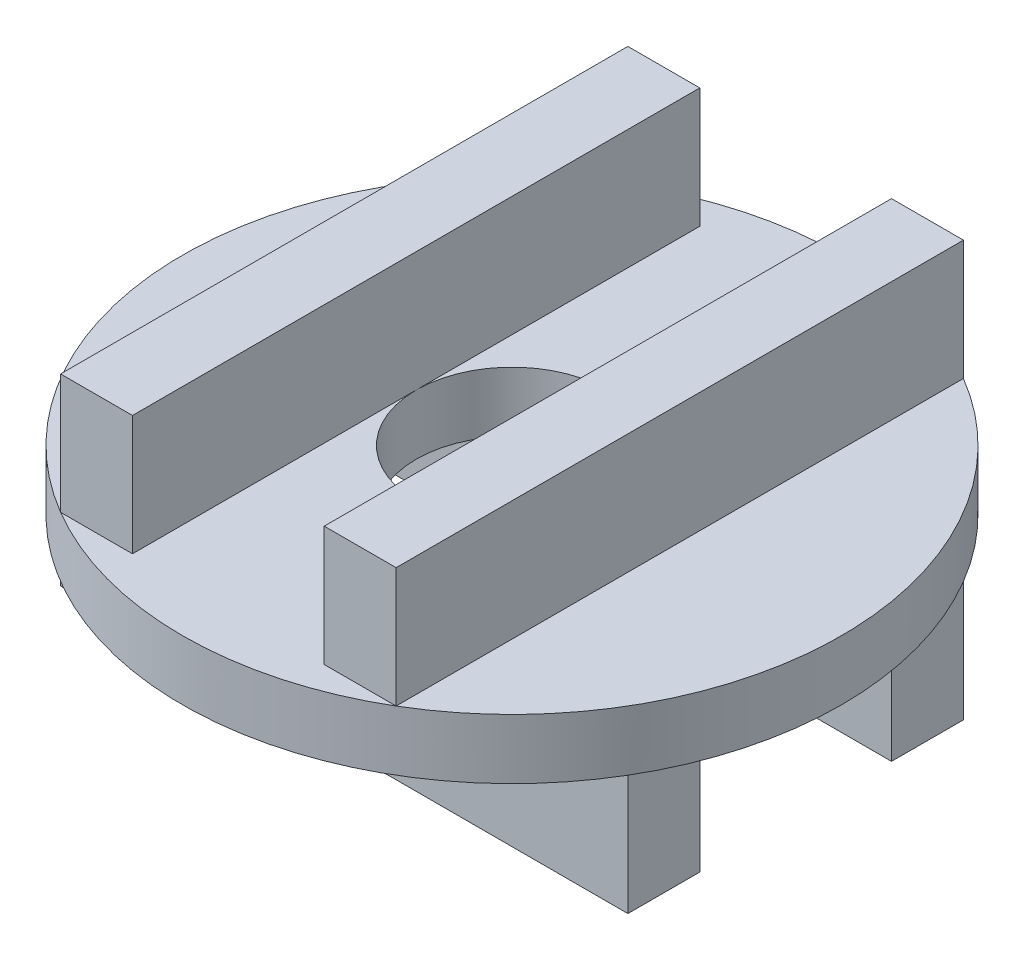
ISO-10303-21;
HEADER;
FILE_DESCRIPTION(('STEP AP214'),'2;1');
FILE_NAME('part.step','',(''),(''),'','','');
FILE_SCHEMA(('AUTOMOTIVE_DESIGN { 1 0 10303 214 1 1 1 1 }'));
ENDSEC;
DATA;
#1=APPLICATION_CONTEXT('core data for automotive mechanical design processes');
#2=APPLICATION_PROTOCOL_DEFINITION('international standard','automotive_design',2000,#1);
#3=PRODUCT_CONTEXT('',#1,'mechanical');
#4=PRODUCT('Part','Part','',(#3));
#5=PRODUCT_RELATED_PRODUCT_CATEGORY('part','',(#4));
#6=PRODUCT_DEFINITION_FORMATION('','',#4);
#7=PRODUCT_DEFINITION_CONTEXT('part definition',#1,'design');
#8=PRODUCT_DEFINITION('design','',#6,#7);
#9=PRODUCT_DEFINITION_SHAPE('','',#8);
#10=(LENGTH_UNIT() NAMED_UNIT(*) SI_UNIT(.MILLI.,.METRE.));
#11=(NAMED_UNIT(*) PLANE_ANGLE_UNIT() SI_UNIT($,.RADIAN.));
#12=(NAMED_UNIT(*) SI_UNIT($,.STERADIAN.) SOLID_ANGLE_UNIT());
#13=UNCERTAINTY_MEASURE_WITH_UNIT(LENGTH_MEASURE(1.E-05),#10,'distance_accuracy_value','');
#14=(GEOMETRIC_REPRESENTATION_CONTEXT(3) GLOBAL_UNCERTAINTY_ASSIGNED_CONTEXT((#13)) GLOBAL_UNIT_ASSIGNED_CONTEXT((#10,
#11,#12)) REPRESENTATION_CONTEXT('',''));
#15=CARTESIAN_POINT('',(0.,0.,0.));
#16=DIRECTION('',(0.,0.,1.));
#17=DIRECTION('',(1.,0.,0.));
#18=AXIS2_PLACEMENT_3D('',#15,#16,#17);
#19=CARTESIAN_POINT('',(0.,0.,0.));
#20=DIRECTION('',(0.,1.,0.));
#21=DIRECTION('',(0.,0.,1.));
#22=AXIS2_PLACEMENT_3D('',#19,#20,#21);
#23=PLANE('',#22);
#24=DIRECTION('',(0.,0.,-1.));
#25=VECTOR('',#24,1.);
#26=CARTESIAN_POINT('',(-47.3392015141785,0.,16.));
#27=LINE('',#26,#25);
#28=CARTESIAN_POINT('',(-47.3392015141785,0.,28.));
#29=VERTEX_POINT('',#28);
#30=CARTESIAN_POINT('',(-47.3392015141785,0.,16.));
#31=VERTEX_POINT('',#30);
#32=EDGE_CURVE('E200',#29,#31,#27,.T.);
#33=ORIENTED_EDGE('',*,*,#32,.F.);
#34=CARTESIAN_POINT('',(0.,0.,0.));
#35=DIRECTION('',(0.,1.,0.));
#36=DIRECTION('',(0.,0.,1.));
#37=AXIS2_PLACEMENT_3D('',#34,#35,#36);
#38=CIRCLE('',#37,55.);
#39=CARTESIAN_POINT('',(-47.3392015141785,0.,-28.));
#40=VERTEX_POINT('',#39);
#41=EDGE_CURVE('E374',#40,#29,#38,.T.);
#42=ORIENTED_EDGE('',*,*,#41,.F.);
#43=DIRECTION('',(0.,0.,-1.));
#44=VECTOR('',#43,1.);
#45=CARTESIAN_POINT('',(-47.3392015141785,0.,-16.));
#46=LINE('',#45,#44);
#47=CARTESIAN_POINT('',(-47.3392015141785,0.,-16.));
#48=VERTEX_POINT('',#47);
#49=EDGE_CURVE('E240',#48,#40,#46,.T.);
#50=ORIENTED_EDGE('',*,*,#49,.F.);
#51=DIRECTION('',(-1.,0.,0.));
#52=VECTOR('',#51,1.);
#53=CARTESIAN_POINT('',(-47.3392015141785,0.,-16.));
#54=LINE('',#53,#52);
#55=CARTESIAN_POINT('',(0.,0.,-16.));
#56=VERTEX_POINT('',#55);
#57=EDGE_CURVE('E54',#56,#48,#54,.T.);
#58=ORIENTED_EDGE('',*,*,#57,.F.);
#59=CARTESIAN_POINT('',(0.,0.,0.));
#60=DIRECTION('',(0.,1.,0.));
#61=DIRECTION('',(0.,0.,1.));
#62=AXIS2_PLACEMENT_3D('',#59,#60,#61);
#63=CIRCLE('',#62,16.);
#64=CARTESIAN_POINT('',(0.,0.,16.));
#65=VERTEX_POINT('',#64);
#66=EDGE_CURVE('E297',#56,#65,#63,.T.);
#67=ORIENTED_EDGE('',*,*,#66,.T.);
#68=DIRECTION('',(1.,0.,0.));
#69=VECTOR('',#68,1.);
#70=CARTESIAN_POINT('',(-47.3392015141785,0.,16.));
#71=LINE('',#70,#69);
#72=EDGE_CURVE('E60',#31,#65,#71,.T.);
#73=ORIENTED_EDGE('',*,*,#72,.F.);
#74=EDGE_LOOP('',(#33,#42,#50,#58,#67,#73));
#75=FACE_BOUND('',#74,.T.);
#76=ADVANCED_FACE('F44',(#75),#23,.F.);
#77=DIRECTION('',(-1.,0.,0.));
#78=VECTOR('',#77,1.);
#79=CARTESIAN_POINT('',(-47.3392015141785,0.,28.));
#80=LINE('',#79,#78);
#81=CARTESIAN_POINT('',(47.3392015141785,0.,28.));
#82=VERTEX_POINT('',#81);
#83=EDGE_CURVE('E198',#82,#29,#80,.T.);
#84=ORIENTED_EDGE('',*,*,#83,.F.);
#85=EDGE_CURVE('E347',#29,#82,#38,.T.);
#86=ORIENTED_EDGE('',*,*,#85,.F.);
#87=EDGE_LOOP('',(#84,#86));
#88=FACE_BOUND('',#87,.T.);
#89=ADVANCED_FACE('F482',(#88),#23,.F.);
#90=DIRECTION('',(0.,0.,1.));
#91=VECTOR('',#90,1.);
#92=CARTESIAN_POINT('',(47.3392015141785,0.,16.));
#93=LINE('',#92,#91);
#94=CARTESIAN_POINT('',(47.3392015141785,0.,16.));
#95=VERTEX_POINT('',#94);
#96=EDGE_CURVE('E394',#95,#82,#93,.T.);
#97=ORIENTED_EDGE('',*,*,#96,.F.);
#98=EDGE_CURVE('E11',#65,#95,#71,.T.);
#99=ORIENTED_EDGE('',*,*,#98,.F.);
#100=EDGE_CURVE('E346',#65,#56,#63,.T.);
#101=ORIENTED_EDGE('',*,*,#100,.T.);
#102=CARTESIAN_POINT('',(47.3392015141785,0.,-16.));
#103=VERTEX_POINT('',#102);
#104=EDGE_CURVE('E72',#103,#56,#54,.T.);
#105=ORIENTED_EDGE('',*,*,#104,.F.);
#106=DIRECTION('',(0.,0.,1.));
#107=VECTOR('',#106,1.);
#108=CARTESIAN_POINT('',(47.3392015141785,0.,-16.));
#109=LINE('',#108,#107);
#110=CARTESIAN_POINT('',(47.3392015141785,0.,-28.));
#111=VERTEX_POINT('',#110);
#112=EDGE_CURVE('E228',#111,#103,#109,.T.);
#113=ORIENTED_EDGE('',*,*,#112,.F.);
#114=EDGE_CURVE('E47',#82,#111,#38,.T.);
#115=ORIENTED_EDGE('',*,*,#114,.F.);
#116=EDGE_LOOP('',(#97,#99,#101,#105,#113,#115));
#117=FACE_BOUND('',#116,.T.);
#118=ADVANCED_FACE('F410',(#117),#23,.F.);
#119=DIRECTION('',(1.,0.,0.));
#120=VECTOR('',#119,1.);
#121=CARTESIAN_POINT('',(-47.3392015141785,0.,-28.));
#122=LINE('',#121,#120);
#123=EDGE_CURVE('E235',#40,#111,#122,.T.);
#124=ORIENTED_EDGE('',*,*,#123,.F.);
#125=EDGE_CURVE('E367',#111,#40,#38,.T.);
#126=ORIENTED_EDGE('',*,*,#125,.F.);
#127=EDGE_LOOP('',(#124,#126));
#128=FACE_BOUND('',#127,.T.);
#129=ADVANCED_FACE('F415',(#128),#23,.F.);
#130=CARTESIAN_POINT('',(0.,10.,0.));
#131=DIRECTION('',(0.,1.,0.));
#132=DIRECTION('',(0.,0.,1.));
#133=AXIS2_PLACEMENT_3D('',#130,#131,#132);
#134=PLANE('',#133);
#135=DIRECTION('',(0.,0.,1.));
#136=VECTOR('',#135,1.);
#137=CARTESIAN_POINT('',(16.,10.,-47.3392015141785));
#138=LINE('',#137,#136);
#139=CARTESIAN_POINT('',(16.,10.,-47.3392015141785));
#140=VERTEX_POINT('',#139);
#141=CARTESIAN_POINT('',(16.,10.,0.));
#142=VERTEX_POINT('',#141);
#143=EDGE_CURVE('E267',#140,#142,#138,.T.);
#144=ORIENTED_EDGE('',*,*,#143,.F.);
#145=DIRECTION('',(-1.,0.,0.));
#146=VECTOR('',#145,1.);
#147=CARTESIAN_POINT('',(16.,10.,-47.3392015141785));
#148=LINE('',#147,#146);
#149=CARTESIAN_POINT('',(28.,10.,-47.3392015141785));
#150=VERTEX_POINT('',#149);
#151=EDGE_CURVE('E259',#150,#140,#148,.T.);
#152=ORIENTED_EDGE('',*,*,#151,.F.);
#153=CARTESIAN_POINT('',(0.,10.,0.));
#154=DIRECTION('',(0.,1.,0.));
#155=DIRECTION('',(0.,0.,1.));
#156=AXIS2_PLACEMENT_3D('',#153,#154,#155);
#157=CIRCLE('',#156,55.);
#158=CARTESIAN_POINT('',(-28.,10.,-47.3392015141785));
#159=VERTEX_POINT('',#158);
#160=EDGE_CURVE('E355',#150,#159,#157,.T.);
#161=ORIENTED_EDGE('',*,*,#160,.T.);
#162=DIRECTION('',(-1.,0.,0.));
#163=VECTOR('',#162,1.);
#164=CARTESIAN_POINT('',(-16.,10.,-47.3392015141785));
#165=LINE('',#164,#163);
#166=CARTESIAN_POINT('',(-16.,10.,-47.3392015141785));
#167=VERTEX_POINT('',#166);
#168=EDGE_CURVE('E273',#167,#159,#165,.T.);
#169=ORIENTED_EDGE('',*,*,#168,.F.);
#170=DIRECTION('',(0.,0.,-1.));
#171=VECTOR('',#170,1.);
#172=CARTESIAN_POINT('',(-16.,10.,-47.3392015141785));
#173=LINE('',#172,#171);
#174=CARTESIAN_POINT('',(-16.,10.,0.));
#175=VERTEX_POINT('',#174);
#176=EDGE_CURVE('E319',#175,#167,#173,.T.);
#177=ORIENTED_EDGE('',*,*,#176,.F.);
#178=CARTESIAN_POINT('',(0.,10.,0.));
#179=DIRECTION('',(0.,1.,0.));
#180=DIRECTION('',(0.,0.,1.));
#181=AXIS2_PLACEMENT_3D('',#178,#179,#180);
#182=CIRCLE('',#181,16.);
#183=EDGE_CURVE('E345',#142,#175,#182,.T.);
#184=ORIENTED_EDGE('',*,*,#183,.F.);
#185=EDGE_LOOP('',(#144,#152,#161,#169,#177,#184));
#186=FACE_BOUND('',#185,.T.);
#187=ADVANCED_FACE('F451',(#186),#134,.T.);
#188=CARTESIAN_POINT('',(16.,10.,47.3392015141785));
#189=VERTEX_POINT('',#188);
#190=EDGE_CURVE('E274',#142,#189,#138,.T.);
#191=ORIENTED_EDGE('',*,*,#190,.F.);
#192=EDGE_CURVE('E350',#175,#142,#182,.T.);
#193=ORIENTED_EDGE('',*,*,#192,.F.);
#194=CARTESIAN_POINT('',(-16.,10.,47.3392015141785));
#195=VERTEX_POINT('',#194);
#196=EDGE_CURVE('E314',#195,#175,#173,.T.);
#197=ORIENTED_EDGE('',*,*,#196,.F.);
#198=DIRECTION('',(1.,0.,0.));
#199=VECTOR('',#198,1.);
#200=CARTESIAN_POINT('',(-16.,10.,47.3392015141785));
#201=LINE('',#200,#199);
#202=CARTESIAN_POINT('',(-28.,10.,47.3392015141785));
#203=VERTEX_POINT('',#202);
#204=EDGE_CURVE('E318',#203,#195,#201,.T.);
#205=ORIENTED_EDGE('',*,*,#204,.F.);
#206=CARTESIAN_POINT('',(28.,10.,47.3392015141785));
#207=VERTEX_POINT('',#206);
#208=EDGE_CURVE('E353',#203,#207,#157,.T.);
#209=ORIENTED_EDGE('',*,*,#208,.T.);
#210=DIRECTION('',(1.,0.,0.));
#211=VECTOR('',#210,1.);
#212=CARTESIAN_POINT('',(16.,10.,47.3392015141785));
#213=LINE('',#212,#211);
#214=EDGE_CURVE('E272',#189,#207,#213,.T.);
#215=ORIENTED_EDGE('',*,*,#214,.F.);
#216=EDGE_LOOP('',(#191,#193,#197,#205,#209,#215));
#217=FACE_BOUND('',#216,.T.);
#218=ADVANCED_FACE('F475',(#217),#134,.T.);
#219=DIRECTION('',(0.,0.,-1.));
#220=VECTOR('',#219,1.);
#221=CARTESIAN_POINT('',(28.,10.,-47.3392015141785));
#222=LINE('',#221,#220);
#223=EDGE_CURVE('E276',#207,#150,#222,.T.);
#224=ORIENTED_EDGE('',*,*,#223,.F.);
#225=EDGE_CURVE('E348',#207,#150,#157,.T.);
#226=ORIENTED_EDGE('',*,*,#225,.T.);
#227=EDGE_LOOP('',(#224,#226));
#228=FACE_BOUND('',#227,.T.);
#229=ADVANCED_FACE('F612',(#228),#134,.T.);
#230=DIRECTION('',(0.,0.,1.));
#231=VECTOR('',#230,1.);
#232=CARTESIAN_POINT('',(-28.,10.,-47.3392015141785));
#233=LINE('',#232,#231);
#234=EDGE_CURVE('E322',#159,#203,#233,.T.);
#235=ORIENTED_EDGE('',*,*,#234,.F.);
#236=EDGE_CURVE('E363',#159,#203,#157,.T.);
#237=ORIENTED_EDGE('',*,*,#236,.T.);
#238=EDGE_LOOP('',(#235,#237));
#239=FACE_BOUND('',#238,.T.);
#240=ADVANCED_FACE('F457',(#239),#134,.T.);
#241=CARTESIAN_POINT('',(0.,10.,0.));
#242=DIRECTION('',(0.,-1.,0.));
#243=DIRECTION('',(0.,0.,-1.));
#244=AXIS2_PLACEMENT_3D('',#241,#242,#243);
#245=CYLINDRICAL_SURFACE('',#244,55.);
#246=ORIENTED_EDGE('',*,*,#225,.F.);
#247=ORIENTED_EDGE('',*,*,#208,.F.);
#248=ORIENTED_EDGE('',*,*,#236,.F.);
#249=ORIENTED_EDGE('',*,*,#160,.F.);
#250=EDGE_LOOP('',(#246,#247,#248,#249));
#251=FACE_BOUND('',#250,.T.);
#252=ORIENTED_EDGE('',*,*,#114,.T.);
#253=ORIENTED_EDGE('',*,*,#125,.T.);
#254=ORIENTED_EDGE('',*,*,#41,.T.);
#255=ORIENTED_EDGE('',*,*,#85,.T.);
#256=EDGE_LOOP('',(#252,#253,#254,#255));
#257=FACE_BOUND('',#256,.T.);
#258=ADVANCED_FACE('F50',(#251,#257),#245,.T.);
#259=CARTESIAN_POINT('',(0.,10.,0.));
#260=DIRECTION('',(0.,-1.,0.));
#261=DIRECTION('',(0.,0.,-1.));
#262=AXIS2_PLACEMENT_3D('',#259,#260,#261);
#263=CYLINDRICAL_SURFACE('',#262,16.);
#264=ORIENTED_EDGE('',*,*,#183,.T.);
#265=ORIENTED_EDGE('',*,*,#192,.T.);
#266=EDGE_LOOP('',(#264,#265));
#267=FACE_BOUND('',#266,.T.);
#268=ORIENTED_EDGE('',*,*,#100,.F.);
#269=ORIENTED_EDGE('',*,*,#66,.F.);
#270=EDGE_LOOP('',(#268,#269));
#271=FACE_BOUND('',#270,.T.);
#272=ADVANCED_FACE('F480',(#267,#271),#263,.F.);
#273=CARTESIAN_POINT('',(-16.,30.,-47.3392015141785));
#274=DIRECTION('',(0.,0.,1.));
#275=DIRECTION('',(1.,0.,0.));
#276=AXIS2_PLACEMENT_3D('',#273,#274,#275);
#277=PLANE('',#276);
#278=ORIENTED_EDGE('',*,*,#168,.T.);
#279=DIRECTION('',(0.,-1.,0.));
#280=VECTOR('',#279,1.);
#281=CARTESIAN_POINT('',(-28.,30.,-47.3392015141785));
#282=LINE('',#281,#280);
#283=CARTESIAN_POINT('',(-28.,30.,-47.3392015141785));
#284=VERTEX_POINT('',#283);
#285=EDGE_CURVE('E203',#284,#159,#282,.T.);
#286=ORIENTED_EDGE('',*,*,#285,.F.);
#287=DIRECTION('',(-1.,0.,0.));
#288=VECTOR('',#287,1.);
#289=CARTESIAN_POINT('',(-16.,30.,-47.3392015141785));
#290=LINE('',#289,#288);
#291=CARTESIAN_POINT('',(-16.,30.,-47.3392015141785));
#292=VERTEX_POINT('',#291);
#293=EDGE_CURVE('E317',#292,#284,#290,.T.);
#294=ORIENTED_EDGE('',*,*,#293,.F.);
#295=DIRECTION('',(0.,-1.,0.));
#296=VECTOR('',#295,1.);
#297=CARTESIAN_POINT('',(-16.,30.,-47.3392015141785));
#298=LINE('',#297,#296);
#299=EDGE_CURVE('E310',#292,#167,#298,.T.);
#300=ORIENTED_EDGE('',*,*,#299,.T.);
#301=EDGE_LOOP('',(#278,#286,#294,#300));
#302=FACE_BOUND('',#301,.T.);
#303=ADVANCED_FACE('F473',(#302),#277,.F.);
#304=CARTESIAN_POINT('',(-28.,30.,-47.3392015141785));
#305=DIRECTION('',(1.,0.,0.));
#306=DIRECTION('',(0.,0.,-1.));
#307=AXIS2_PLACEMENT_3D('',#304,#305,#306);
#308=PLANE('',#307);
#309=ORIENTED_EDGE('',*,*,#234,.T.);
#310=DIRECTION('',(0.,-1.,0.));
#311=VECTOR('',#310,1.);
#312=CARTESIAN_POINT('',(-28.,30.,47.3392015141785));
#313=LINE('',#312,#311);
#314=CARTESIAN_POINT('',(-28.,30.,47.3392015141785));
#315=VERTEX_POINT('',#314);
#316=EDGE_CURVE('E206',#315,#203,#313,.T.);
#317=ORIENTED_EDGE('',*,*,#316,.F.);
#318=DIRECTION('',(0.,0.,1.));
#319=VECTOR('',#318,1.);
#320=CARTESIAN_POINT('',(-28.,30.,-47.3392015141785));
#321=LINE('',#320,#319);
#322=EDGE_CURVE('E339',#284,#315,#321,.T.);
#323=ORIENTED_EDGE('',*,*,#322,.F.);
#324=ORIENTED_EDGE('',*,*,#285,.T.);
#325=EDGE_LOOP('',(#309,#317,#323,#324));
#326=FACE_BOUND('',#325,.T.);
#327=ADVANCED_FACE('F459',(#326),#308,.F.);
#328=CARTESIAN_POINT('',(-16.,30.,47.3392015141785));
#329=DIRECTION('',(0.,0.,-1.));
#330=DIRECTION('',(-1.,0.,0.));
#331=AXIS2_PLACEMENT_3D('',#328,#329,#330);
#332=PLANE('',#331);
#333=ORIENTED_EDGE('',*,*,#204,.T.);
#334=DIRECTION('',(0.,-1.,0.));
#335=VECTOR('',#334,1.);
#336=CARTESIAN_POINT('',(-16.,30.,47.3392015141785));
#337=LINE('',#336,#335);
#338=CARTESIAN_POINT('',(-16.,30.,47.3392015141785));
#339=VERTEX_POINT('',#338);
#340=EDGE_CURVE('E304',#339,#195,#337,.T.);
#341=ORIENTED_EDGE('',*,*,#340,.F.);
#342=DIRECTION('',(1.,0.,0.));
#343=VECTOR('',#342,1.);
#344=CARTESIAN_POINT('',(-16.,30.,47.3392015141785));
#345=LINE('',#344,#343);
#346=EDGE_CURVE('E334',#315,#339,#345,.T.);
#347=ORIENTED_EDGE('',*,*,#346,.F.);
#348=ORIENTED_EDGE('',*,*,#316,.T.);
#349=EDGE_LOOP('',(#333,#341,#347,#348));
#350=FACE_BOUND('',#349,.T.);
#351=ADVANCED_FACE('F465',(#350),#332,.F.);
#352=CARTESIAN_POINT('',(-16.,30.,-47.3392015141785));
#353=DIRECTION('',(-1.,0.,0.));
#354=DIRECTION('',(0.,0.,1.));
#355=AXIS2_PLACEMENT_3D('',#352,#353,#354);
#356=PLANE('',#355);
#357=ORIENTED_EDGE('',*,*,#196,.T.);
#358=ORIENTED_EDGE('',*,*,#176,.T.);
#359=ORIENTED_EDGE('',*,*,#299,.F.);
#360=DIRECTION('',(0.,0.,-1.));
#361=VECTOR('',#360,1.);
#362=CARTESIAN_POINT('',(-16.,30.,-47.3392015141785));
#363=LINE('',#362,#361);
#364=EDGE_CURVE('E311',#339,#292,#363,.T.);
#365=ORIENTED_EDGE('',*,*,#364,.F.);
#366=ORIENTED_EDGE('',*,*,#340,.T.);
#367=EDGE_LOOP('',(#357,#358,#359,#365,#366));
#368=FACE_BOUND('',#367,.T.);
#369=ADVANCED_FACE('F471',(#368),#356,.F.);
#370=CARTESIAN_POINT('',(0.,30.,0.));
#371=DIRECTION('',(0.,1.,0.));
#372=DIRECTION('',(0.,0.,1.));
#373=AXIS2_PLACEMENT_3D('',#370,#371,#372);
#374=PLANE('',#373);
#375=ORIENTED_EDGE('',*,*,#293,.T.);
#376=ORIENTED_EDGE('',*,*,#322,.T.);
#377=ORIENTED_EDGE('',*,*,#346,.T.);
#378=ORIENTED_EDGE('',*,*,#364,.T.);
#379=EDGE_LOOP('',(#375,#376,#377,#378));
#380=FACE_BOUND('',#379,.T.);
#381=ADVANCED_FACE('F470',(#380),#374,.T.);
#382=CARTESIAN_POINT('',(16.,30.,-47.3392015141785));
#383=DIRECTION('',(1.,0.,0.));
#384=DIRECTION('',(0.,0.,-1.));
#385=AXIS2_PLACEMENT_3D('',#382,#383,#384);
#386=PLANE('',#385);
#387=ORIENTED_EDGE('',*,*,#143,.T.);
#388=ORIENTED_EDGE('',*,*,#190,.T.);
#389=DIRECTION('',(0.,-1.,0.));
#390=VECTOR('',#389,1.);
#391=CARTESIAN_POINT('',(16.,30.,47.3392015141785));
#392=LINE('',#391,#390);
#393=CARTESIAN_POINT('',(16.,30.,47.3392015141785));
#394=VERTEX_POINT('',#393);
#395=EDGE_CURVE('E296',#394,#189,#392,.T.);
#396=ORIENTED_EDGE('',*,*,#395,.F.);
#397=DIRECTION('',(0.,0.,1.));
#398=VECTOR('',#397,1.);
#399=CARTESIAN_POINT('',(16.,30.,-47.3392015141785));
#400=LINE('',#399,#398);
#401=CARTESIAN_POINT('',(16.,30.,-47.3392015141785));
#402=VERTEX_POINT('',#401);
#403=EDGE_CURVE('E255',#402,#394,#400,.T.);
#404=ORIENTED_EDGE('',*,*,#403,.F.);
#405=DIRECTION('',(0.,-1.,0.));
#406=VECTOR('',#405,1.);
#407=CARTESIAN_POINT('',(16.,30.,-47.3392015141785));
#408=LINE('',#407,#406);
#409=EDGE_CURVE('E268',#402,#140,#408,.T.);
#410=ORIENTED_EDGE('',*,*,#409,.T.);
#411=EDGE_LOOP('',(#387,#388,#396,#404,#410));
#412=FACE_BOUND('',#411,.T.);
#413=ADVANCED_FACE('F432',(#412),#386,.F.);
#414=CARTESIAN_POINT('',(16.,30.,47.3392015141785));
#415=DIRECTION('',(0.,0.,-1.));
#416=DIRECTION('',(-1.,0.,0.));
#417=AXIS2_PLACEMENT_3D('',#414,#415,#416);
#418=PLANE('',#417);
#419=ORIENTED_EDGE('',*,*,#214,.T.);
#420=DIRECTION('',(0.,-1.,0.));
#421=VECTOR('',#420,1.);
#422=CARTESIAN_POINT('',(28.,30.,47.3392015141785));
#423=LINE('',#422,#421);
#424=CARTESIAN_POINT('',(28.,30.,47.3392015141785));
#425=VERTEX_POINT('',#424);
#426=EDGE_CURVE('E291',#425,#207,#423,.T.);
#427=ORIENTED_EDGE('',*,*,#426,.F.);
#428=DIRECTION('',(1.,0.,0.));
#429=VECTOR('',#428,1.);
#430=CARTESIAN_POINT('',(16.,30.,47.3392015141785));
#431=LINE('',#430,#429);
#432=EDGE_CURVE('E256',#394,#425,#431,.T.);
#433=ORIENTED_EDGE('',*,*,#432,.F.);
#434=ORIENTED_EDGE('',*,*,#395,.T.);
#435=EDGE_LOOP('',(#419,#427,#433,#434));
#436=FACE_BOUND('',#435,.T.);
#437=ADVANCED_FACE('F438',(#436),#418,.F.);
#438=CARTESIAN_POINT('',(28.,30.,-47.3392015141785));
#439=DIRECTION('',(-1.,0.,0.));
#440=DIRECTION('',(0.,0.,1.));
#441=AXIS2_PLACEMENT_3D('',#438,#439,#440);
#442=PLANE('',#441);
#443=ORIENTED_EDGE('',*,*,#223,.T.);
#444=DIRECTION('',(0.,-1.,0.));
#445=VECTOR('',#444,1.);
#446=CARTESIAN_POINT('',(28.,30.,-47.3392015141785));
#447=LINE('',#446,#445);
#448=CARTESIAN_POINT('',(28.,30.,-47.3392015141785));
#449=VERTEX_POINT('',#448);
#450=EDGE_CURVE('E288',#449,#150,#447,.T.);
#451=ORIENTED_EDGE('',*,*,#450,.F.);
#452=DIRECTION('',(0.,0.,-1.));
#453=VECTOR('',#452,1.);
#454=CARTESIAN_POINT('',(28.,30.,-47.3392015141785));
#455=LINE('',#454,#453);
#456=EDGE_CURVE('E265',#425,#449,#455,.T.);
#457=ORIENTED_EDGE('',*,*,#456,.F.);
#458=ORIENTED_EDGE('',*,*,#426,.T.);
#459=EDGE_LOOP('',(#443,#451,#457,#458));
#460=FACE_BOUND('',#459,.T.);
#461=ADVANCED_FACE('F600',(#460),#442,.F.);
#462=CARTESIAN_POINT('',(16.,30.,-47.3392015141785));
#463=DIRECTION('',(0.,0.,1.));
#464=DIRECTION('',(1.,0.,0.));
#465=AXIS2_PLACEMENT_3D('',#462,#463,#464);
#466=PLANE('',#465);
#467=ORIENTED_EDGE('',*,*,#151,.T.);
#468=ORIENTED_EDGE('',*,*,#409,.F.);
#469=DIRECTION('',(-1.,0.,0.));
#470=VECTOR('',#469,1.);
#471=CARTESIAN_POINT('',(16.,30.,-47.3392015141785));
#472=LINE('',#471,#470);
#473=EDGE_CURVE('E264',#449,#402,#472,.T.);
#474=ORIENTED_EDGE('',*,*,#473,.F.);
#475=ORIENTED_EDGE('',*,*,#450,.T.);
#476=EDGE_LOOP('',(#467,#468,#474,#475));
#477=FACE_BOUND('',#476,.T.);
#478=ADVANCED_FACE('F446',(#477),#466,.F.);
#479=CARTESIAN_POINT('',(0.,30.,0.));
#480=DIRECTION('',(0.,1.,0.));
#481=DIRECTION('',(0.,0.,1.));
#482=AXIS2_PLACEMENT_3D('',#479,#480,#481);
#483=PLANE('',#482);
#484=ORIENTED_EDGE('',*,*,#403,.T.);
#485=ORIENTED_EDGE('',*,*,#432,.T.);
#486=ORIENTED_EDGE('',*,*,#456,.T.);
#487=ORIENTED_EDGE('',*,*,#473,.T.);
#488=EDGE_LOOP('',(#484,#485,#486,#487));
#489=FACE_BOUND('',#488,.T.);
#490=ADVANCED_FACE('F444',(#489),#483,.T.);
#491=CARTESIAN_POINT('',(-47.3392015141785,-20.,-16.));
#492=DIRECTION('',(0.,0.,-1.));
#493=DIRECTION('',(-1.,0.,0.));
#494=AXIS2_PLACEMENT_3D('',#491,#492,#493);
#495=PLANE('',#494);
#496=ORIENTED_EDGE('',*,*,#104,.T.);
#497=ORIENTED_EDGE('',*,*,#57,.T.);
#498=DIRECTION('',(0.,1.,0.));
#499=VECTOR('',#498,1.);
#500=CARTESIAN_POINT('',(-47.3392015141785,-20.,-16.));
#501=LINE('',#500,#499);
#502=CARTESIAN_POINT('',(-47.3392015141785,-20.,-16.));
#503=VERTEX_POINT('',#502);
#504=EDGE_CURVE('E215',#503,#48,#501,.T.);
#505=ORIENTED_EDGE('',*,*,#504,.F.);
#506=DIRECTION('',(-1.,0.,0.));
#507=VECTOR('',#506,1.);
#508=CARTESIAN_POINT('',(-47.3392015141785,-20.,-16.));
#509=LINE('',#508,#507);
#510=CARTESIAN_POINT('',(47.3392015141785,-20.,-16.));
#511=VERTEX_POINT('',#510);
#512=EDGE_CURVE('E232',#511,#503,#509,.T.);
#513=ORIENTED_EDGE('',*,*,#512,.F.);
#514=DIRECTION('',(0.,1.,0.));
#515=VECTOR('',#514,1.);
#516=CARTESIAN_POINT('',(47.3392015141785,-20.,-16.));
#517=LINE('',#516,#515);
#518=EDGE_CURVE('E221',#511,#103,#517,.T.);
#519=ORIENTED_EDGE('',*,*,#518,.T.);
#520=EDGE_LOOP('',(#496,#497,#505,#513,#519));
#521=FACE_BOUND('',#520,.T.);
#522=ADVANCED_FACE('F430',(#521),#495,.F.);
#523=CARTESIAN_POINT('',(-47.3392015141785,-20.,-16.));
#524=DIRECTION('',(1.,0.,0.));
#525=DIRECTION('',(0.,0.,-1.));
#526=AXIS2_PLACEMENT_3D('',#523,#524,#525);
#527=PLANE('',#526);
#528=ORIENTED_EDGE('',*,*,#49,.T.);
#529=DIRECTION('',(0.,1.,0.));
#530=VECTOR('',#529,1.);
#531=CARTESIAN_POINT('',(-47.3392015141785,-20.,-28.));
#532=LINE('',#531,#530);
#533=CARTESIAN_POINT('',(-47.3392015141785,-20.,-28.));
#534=VERTEX_POINT('',#533);
#535=EDGE_CURVE('E216',#534,#40,#532,.T.);
#536=ORIENTED_EDGE('',*,*,#535,.F.);
#537=DIRECTION('',(0.,0.,-1.));
#538=VECTOR('',#537,1.);
#539=CARTESIAN_POINT('',(-47.3392015141785,-20.,-16.));
#540=LINE('',#539,#538);
#541=EDGE_CURVE('E247',#503,#534,#540,.T.);
#542=ORIENTED_EDGE('',*,*,#541,.F.);
#543=ORIENTED_EDGE('',*,*,#504,.T.);
#544=EDGE_LOOP('',(#528,#536,#542,#543));
#545=FACE_BOUND('',#544,.T.);
#546=ADVANCED_FACE('F417',(#545),#527,.F.);
#547=CARTESIAN_POINT('',(-47.3392015141785,-20.,-28.));
#548=DIRECTION('',(0.,0.,1.));
#549=DIRECTION('',(1.,0.,0.));
#550=AXIS2_PLACEMENT_3D('',#547,#548,#549);
#551=PLANE('',#550);
#552=ORIENTED_EDGE('',*,*,#123,.T.);
#553=DIRECTION('',(0.,1.,0.));
#554=VECTOR('',#553,1.);
#555=CARTESIAN_POINT('',(47.3392015141785,-20.,-28.));
#556=LINE('',#555,#554);
#557=CARTESIAN_POINT('',(47.3392015141785,-20.,-28.));
#558=VERTEX_POINT('',#557);
#559=EDGE_CURVE('E219',#558,#111,#556,.T.);
#560=ORIENTED_EDGE('',*,*,#559,.F.);
#561=DIRECTION('',(1.,0.,0.));
#562=VECTOR('',#561,1.);
#563=CARTESIAN_POINT('',(-47.3392015141785,-20.,-28.));
#564=LINE('',#563,#562);
#565=EDGE_CURVE('E242',#534,#558,#564,.T.);
#566=ORIENTED_EDGE('',*,*,#565,.F.);
#567=ORIENTED_EDGE('',*,*,#535,.T.);
#568=EDGE_LOOP('',(#552,#560,#566,#567));
#569=FACE_BOUND('',#568,.T.);
#570=ADVANCED_FACE('F423',(#569),#551,.F.);
#571=CARTESIAN_POINT('',(47.3392015141785,-20.,-16.));
#572=DIRECTION('',(-1.,0.,0.));
#573=DIRECTION('',(0.,0.,1.));
#574=AXIS2_PLACEMENT_3D('',#571,#572,#573);
#575=PLANE('',#574);
#576=ORIENTED_EDGE('',*,*,#112,.T.);
#577=ORIENTED_EDGE('',*,*,#518,.F.);
#578=DIRECTION('',(0.,0.,1.));
#579=VECTOR('',#578,1.);
#580=CARTESIAN_POINT('',(47.3392015141785,-20.,-16.));
#581=LINE('',#580,#579);
#582=EDGE_CURVE('E230',#558,#511,#581,.T.);
#583=ORIENTED_EDGE('',*,*,#582,.F.);
#584=ORIENTED_EDGE('',*,*,#559,.T.);
#585=EDGE_LOOP('',(#576,#577,#583,#584));
#586=FACE_BOUND('',#585,.T.);
#587=ADVANCED_FACE('F534',(#586),#575,.F.);
#588=CARTESIAN_POINT('',(0.,-20.,0.));
#589=DIRECTION('',(0.,1.,0.));
#590=DIRECTION('',(0.,0.,1.));
#591=AXIS2_PLACEMENT_3D('',#588,#589,#590);
#592=PLANE('',#591);
#593=ORIENTED_EDGE('',*,*,#512,.T.);
#594=ORIENTED_EDGE('',*,*,#541,.T.);
#595=ORIENTED_EDGE('',*,*,#565,.T.);
#596=ORIENTED_EDGE('',*,*,#582,.T.);
#597=EDGE_LOOP('',(#593,#594,#595,#596));
#598=FACE_BOUND('',#597,.T.);
#599=ADVANCED_FACE('F424',(#598),#592,.F.);
#600=CARTESIAN_POINT('',(-47.3392015141785,-20.,16.));
#601=DIRECTION('',(1.,0.,0.));
#602=DIRECTION('',(0.,0.,-1.));
#603=AXIS2_PLACEMENT_3D('',#600,#601,#602);
#604=PLANE('',#603);
#605=ORIENTED_EDGE('',*,*,#32,.T.);
#606=DIRECTION('',(0.,1.,0.));
#607=VECTOR('',#606,1.);
#608=CARTESIAN_POINT('',(-47.3392015141785,-20.,16.));
#609=LINE('',#608,#607);
#610=CARTESIAN_POINT('',(-47.3392015141785,-20.,16.));
#611=VERTEX_POINT('',#610);
#612=EDGE_CURVE('E177',#611,#31,#609,.T.);
#613=ORIENTED_EDGE('',*,*,#612,.F.);
#614=DIRECTION('',(0.,0.,-1.));
#615=VECTOR('',#614,1.);
#616=CARTESIAN_POINT('',(-47.3392015141785,-20.,16.));
#617=LINE('',#616,#615);
#618=CARTESIAN_POINT('',(-47.3392015141785,-20.,28.));
#619=VERTEX_POINT('',#618);
#620=EDGE_CURVE('E189',#619,#611,#617,.T.);
#621=ORIENTED_EDGE('',*,*,#620,.F.);
#622=DIRECTION('',(0.,1.,0.));
#623=VECTOR('',#622,1.);
#624=CARTESIAN_POINT('',(-47.3392015141785,-20.,28.));
#625=LINE('',#624,#623);
#626=EDGE_CURVE('E390',#619,#29,#625,.T.);
#627=ORIENTED_EDGE('',*,*,#626,.T.);
#628=EDGE_LOOP('',(#605,#613,#621,#627));
#629=FACE_BOUND('',#628,.T.);
#630=ADVANCED_FACE('F196',(#629),#604,.F.);
#631=CARTESIAN_POINT('',(-47.3392015141785,-20.,16.));
#632=DIRECTION('',(0.,0.,1.));
#633=DIRECTION('',(1.,0.,0.));
#634=AXIS2_PLACEMENT_3D('',#631,#632,#633);
#635=PLANE('',#634);
#636=ORIENTED_EDGE('',*,*,#72,.T.);
#637=ORIENTED_EDGE('',*,*,#98,.T.);
#638=DIRECTION('',(0.,1.,0.));
#639=VECTOR('',#638,1.);
#640=CARTESIAN_POINT('',(47.3392015141785,-20.,16.));
#641=LINE('',#640,#639);
#642=CARTESIAN_POINT('',(47.3392015141785,-20.,16.));
#643=VERTEX_POINT('',#642);
#644=EDGE_CURVE('E182',#643,#95,#641,.T.);
#645=ORIENTED_EDGE('',*,*,#644,.F.);
#646=DIRECTION('',(1.,0.,0.));
#647=VECTOR('',#646,1.);
#648=CARTESIAN_POINT('',(-47.3392015141785,-20.,16.));
#649=LINE('',#648,#647);
#650=EDGE_CURVE('E173',#611,#643,#649,.T.);
#651=ORIENTED_EDGE('',*,*,#650,.F.);
#652=ORIENTED_EDGE('',*,*,#612,.T.);
#653=EDGE_LOOP('',(#636,#637,#645,#651,#652));
#654=FACE_BOUND('',#653,.T.);
#655=ADVANCED_FACE('F176',(#654),#635,.F.);
#656=CARTESIAN_POINT('',(47.3392015141785,-20.,16.));
#657=DIRECTION('',(-1.,0.,0.));
#658=DIRECTION('',(0.,0.,1.));
#659=AXIS2_PLACEMENT_3D('',#656,#657,#658);
#660=PLANE('',#659);
#661=ORIENTED_EDGE('',*,*,#96,.T.);
#662=DIRECTION('',(0.,1.,0.));
#663=VECTOR('',#662,1.);
#664=CARTESIAN_POINT('',(47.3392015141785,-20.,28.));
#665=LINE('',#664,#663);
#666=CARTESIAN_POINT('',(47.3392015141785,-20.,28.));
#667=VERTEX_POINT('',#666);
#668=EDGE_CURVE('E208',#667,#82,#665,.T.);
#669=ORIENTED_EDGE('',*,*,#668,.F.);
#670=DIRECTION('',(0.,0.,1.));
#671=VECTOR('',#670,1.);
#672=CARTESIAN_POINT('',(47.3392015141785,-20.,16.));
#673=LINE('',#672,#671);
#674=EDGE_CURVE('E183',#643,#667,#673,.T.);
#675=ORIENTED_EDGE('',*,*,#674,.F.);
#676=ORIENTED_EDGE('',*,*,#644,.T.);
#677=EDGE_LOOP('',(#661,#669,#675,#676));
#678=FACE_BOUND('',#677,.T.);
#679=ADVANCED_FACE('F406',(#678),#660,.F.);
#680=CARTESIAN_POINT('',(-47.3392015141785,-20.,28.));
#681=DIRECTION('',(0.,0.,-1.));
#682=DIRECTION('',(-1.,0.,0.));
#683=AXIS2_PLACEMENT_3D('',#680,#681,#682);
#684=PLANE('',#683);
#685=ORIENTED_EDGE('',*,*,#83,.T.);
#686=ORIENTED_EDGE('',*,*,#626,.F.);
#687=DIRECTION('',(-1.,0.,0.));
#688=VECTOR('',#687,1.);
#689=CARTESIAN_POINT('',(-47.3392015141785,-20.,28.));
#690=LINE('',#689,#688);
#691=EDGE_CURVE('E191',#667,#619,#690,.T.);
#692=ORIENTED_EDGE('',*,*,#691,.F.);
#693=ORIENTED_EDGE('',*,*,#668,.T.);
#694=EDGE_LOOP('',(#685,#686,#692,#693));
#695=FACE_BOUND('',#694,.T.);
#696=ADVANCED_FACE('F387',(#695),#684,.F.);
#697=CARTESIAN_POINT('',(0.,-20.,0.));
#698=DIRECTION('',(0.,1.,0.));
#699=DIRECTION('',(0.,0.,1.));
#700=AXIS2_PLACEMENT_3D('',#697,#698,#699);
#701=PLANE('',#700);
#702=ORIENTED_EDGE('',*,*,#620,.T.);
#703=ORIENTED_EDGE('',*,*,#650,.T.);
#704=ORIENTED_EDGE('',*,*,#674,.T.);
#705=ORIENTED_EDGE('',*,*,#691,.T.);
#706=EDGE_LOOP('',(#702,#703,#704,#705));
#707=FACE_BOUND('',#706,.T.);
#708=ADVANCED_FACE('F188',(#707),#701,.F.);
#709=CLOSED_SHELL('',(#76,#89,#118,#129,#187,#218,#229,#240,#258,#272,#303,#327,#351,#369,#381,
#413,#437,#461,#478,#490,#522,#546,#570,#587,#599,#630,#655,#679,#696,#708));
#710=MANIFOLD_SOLID_BREP('B2',#709);
#711=ADVANCED_BREP_SHAPE_REPRESENTATION('',(#18,#710),#14);
#712=SHAPE_DEFINITION_REPRESENTATION(#9,#711);
ENDSEC;
END-ISO-10303-21;
